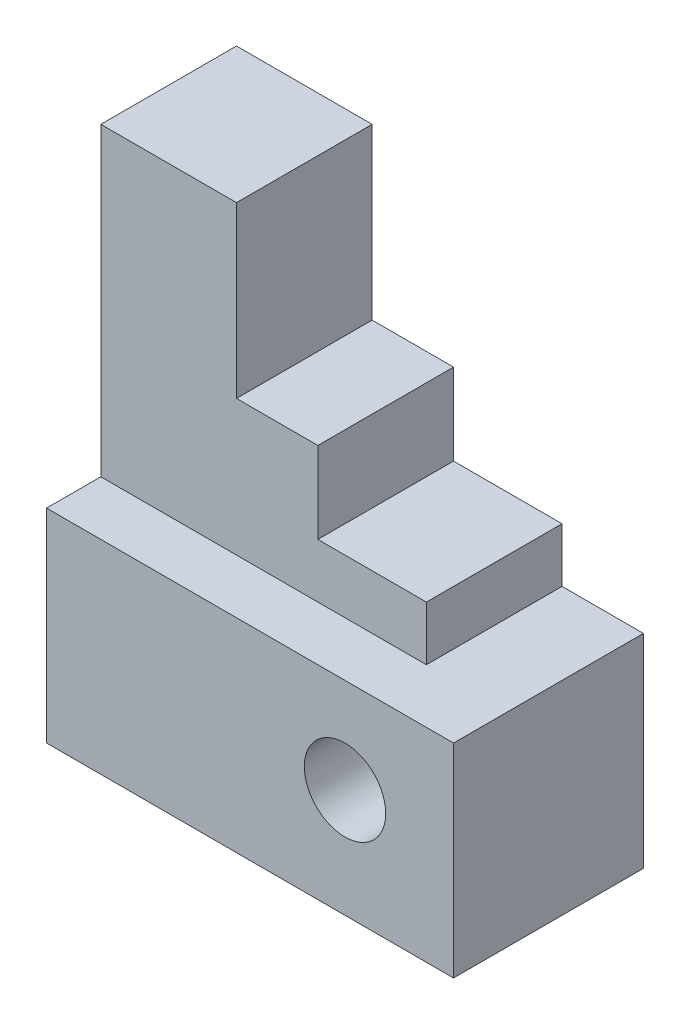
ISO-10303-21;
HEADER;
FILE_DESCRIPTION(('STEP AP214'),'2;1');
FILE_NAME('part.step','',(''),(''),'','','');
FILE_SCHEMA(('AUTOMOTIVE_DESIGN { 1 0 10303 214 1 1 1 1 }'));
ENDSEC;
DATA;
#1=APPLICATION_CONTEXT('core data for automotive mechanical design processes');
#2=APPLICATION_PROTOCOL_DEFINITION('international standard','automotive_design',2000,#1);
#3=PRODUCT_CONTEXT('',#1,'mechanical');
#4=PRODUCT('Part','Part','',(#3));
#5=PRODUCT_RELATED_PRODUCT_CATEGORY('part','',(#4));
#6=PRODUCT_DEFINITION_FORMATION('','',#4);
#7=PRODUCT_DEFINITION_CONTEXT('part definition',#1,'design');
#8=PRODUCT_DEFINITION('design','',#6,#7);
#9=PRODUCT_DEFINITION_SHAPE('','',#8);
#10=(LENGTH_UNIT() NAMED_UNIT(*) SI_UNIT(.MILLI.,.METRE.));
#11=(NAMED_UNIT(*) PLANE_ANGLE_UNIT() SI_UNIT($,.RADIAN.));
#12=(NAMED_UNIT(*) SI_UNIT($,.STERADIAN.) SOLID_ANGLE_UNIT());
#13=UNCERTAINTY_MEASURE_WITH_UNIT(LENGTH_MEASURE(1.E-05),#10,'distance_accuracy_value','');
#14=(GEOMETRIC_REPRESENTATION_CONTEXT(3) GLOBAL_UNCERTAINTY_ASSIGNED_CONTEXT((#13)) GLOBAL_UNIT_ASSIGNED_CONTEXT((#10,
#11,#12)) REPRESENTATION_CONTEXT('',''));
#15=CARTESIAN_POINT('',(0.,0.,0.));
#16=DIRECTION('',(0.,0.,1.));
#17=DIRECTION('',(1.,0.,0.));
#18=AXIS2_PLACEMENT_3D('',#15,#16,#17);
#19=CARTESIAN_POINT('',(0.,75.,-28.));
#20=DIRECTION('',(0.,0.,1.));
#21=DIRECTION('',(1.,0.,0.));
#22=AXIS2_PLACEMENT_3D('',#19,#20,#21);
#23=PLANE('',#22);
#24=CARTESIAN_POINT('',(44.,16.,-28.));
#25=DIRECTION('',(0.,0.,1.));
#26=DIRECTION('',(1.,0.,0.));
#27=AXIS2_PLACEMENT_3D('',#24,#25,#26);
#28=CIRCLE('',#27,6.);
#29=CARTESIAN_POINT('',(50.,16.,-28.));
#30=VERTEX_POINT('',#29);
#31=EDGE_CURVE('E176',#30,#30,#28,.T.);
#32=ORIENTED_EDGE('',*,*,#31,.T.);
#33=EDGE_LOOP('',(#32));
#34=FACE_BOUND('',#33,.T.);
#35=DIRECTION('',(0.,1.,0.));
#36=VECTOR('',#35,1.);
#37=CARTESIAN_POINT('',(20.,0.,-28.));
#38=LINE('',#37,#36);
#39=CARTESIAN_POINT('',(20.,50.,-28.));
#40=VERTEX_POINT('',#39);
#41=CARTESIAN_POINT('',(20.,75.,-28.));
#42=VERTEX_POINT('',#41);
#43=EDGE_CURVE('E224',#40,#42,#38,.T.);
#44=ORIENTED_EDGE('',*,*,#43,.F.);
#45=DIRECTION('',(-1.,0.,0.));
#46=VECTOR('',#45,1.);
#47=CARTESIAN_POINT('',(0.,50.,-28.));
#48=LINE('',#47,#46);
#49=CARTESIAN_POINT('',(32.,50.,-28.));
#50=VERTEX_POINT('',#49);
#51=EDGE_CURVE('E255',#50,#40,#48,.T.);
#52=ORIENTED_EDGE('',*,*,#51,.F.);
#53=DIRECTION('',(0.,1.,0.));
#54=VECTOR('',#53,1.);
#55=CARTESIAN_POINT('',(32.,0.,-28.));
#56=LINE('',#55,#54);
#57=CARTESIAN_POINT('',(32.,38.,-28.));
#58=VERTEX_POINT('',#57);
#59=EDGE_CURVE('E261',#58,#50,#56,.T.);
#60=ORIENTED_EDGE('',*,*,#59,.F.);
#61=DIRECTION('',(1.,0.,0.));
#62=VECTOR('',#61,1.);
#63=CARTESIAN_POINT('',(0.,38.,-28.));
#64=LINE('',#63,#62);
#65=CARTESIAN_POINT('',(48.,38.,-28.));
#66=VERTEX_POINT('',#65);
#67=EDGE_CURVE('E152',#58,#66,#64,.T.);
#68=ORIENTED_EDGE('',*,*,#67,.T.);
#69=DIRECTION('',(0.,1.,0.));
#70=VECTOR('',#69,1.);
#71=CARTESIAN_POINT('',(48.,30.,-28.));
#72=LINE('',#71,#70);
#73=CARTESIAN_POINT('',(48.,30.,-28.));
#74=VERTEX_POINT('',#73);
#75=EDGE_CURVE('E198',#74,#66,#72,.T.);
#76=ORIENTED_EDGE('',*,*,#75,.F.);
#77=DIRECTION('',(-1.,0.,0.));
#78=VECTOR('',#77,1.);
#79=CARTESIAN_POINT('',(60.,30.,-28.));
#80=LINE('',#79,#78);
#81=CARTESIAN_POINT('',(60.,30.,-28.));
#82=VERTEX_POINT('',#81);
#83=EDGE_CURVE('E92',#82,#74,#80,.T.);
#84=ORIENTED_EDGE('',*,*,#83,.F.);
#85=DIRECTION('',(0.,-1.,0.));
#86=VECTOR('',#85,1.);
#87=CARTESIAN_POINT('',(60.,75.,-28.));
#88=LINE('',#87,#86);
#89=CARTESIAN_POINT('',(60.,0.,-28.));
#90=VERTEX_POINT('',#89);
#91=EDGE_CURVE('E83',#82,#90,#88,.T.);
#92=ORIENTED_EDGE('',*,*,#91,.T.);
#93=DIRECTION('',(-1.,0.,0.));
#94=VECTOR('',#93,1.);
#95=CARTESIAN_POINT('',(0.,0.,-28.));
#96=LINE('',#95,#94);
#97=CARTESIAN_POINT('',(0.,0.,-28.));
#98=VERTEX_POINT('',#97);
#99=EDGE_CURVE('E87',#90,#98,#96,.T.);
#100=ORIENTED_EDGE('',*,*,#99,.T.);
#101=DIRECTION('',(0.,-1.,0.));
#102=VECTOR('',#101,1.);
#103=CARTESIAN_POINT('',(0.,75.,-28.));
#104=LINE('',#103,#102);
#105=CARTESIAN_POINT('',(0.,75.,-28.));
#106=VERTEX_POINT('',#105);
#107=EDGE_CURVE('E97',#106,#98,#104,.T.);
#108=ORIENTED_EDGE('',*,*,#107,.F.);
#109=DIRECTION('',(-1.,0.,0.));
#110=VECTOR('',#109,1.);
#111=CARTESIAN_POINT('',(0.,75.,-28.));
#112=LINE('',#111,#110);
#113=EDGE_CURVE('E64',#42,#106,#112,.T.);
#114=ORIENTED_EDGE('',*,*,#113,.F.);
#115=EDGE_LOOP('',(#44,#52,#60,#68,#76,#84,#92,#100,#108,#114));
#116=FACE_BOUND('',#115,.T.);
#117=ADVANCED_FACE('F39',(#34,#116),#23,.F.);
#118=CARTESIAN_POINT('',(0.,75.,0.));
#119=DIRECTION('',(0.,-1.,0.));
#120=DIRECTION('',(0.,0.,-1.));
#121=AXIS2_PLACEMENT_3D('',#118,#119,#120);
#122=PLANE('',#121);
#123=DIRECTION('',(0.,0.,1.));
#124=VECTOR('',#123,1.);
#125=CARTESIAN_POINT('',(20.,75.,-28.));
#126=LINE('',#125,#124);
#127=CARTESIAN_POINT('',(20.,75.,-8.));
#128=VERTEX_POINT('',#127);
#129=EDGE_CURVE('E165',#42,#128,#126,.T.);
#130=ORIENTED_EDGE('',*,*,#129,.F.);
#131=ORIENTED_EDGE('',*,*,#113,.T.);
#132=DIRECTION('',(0.,0.,1.));
#133=VECTOR('',#132,1.);
#134=CARTESIAN_POINT('',(0.,75.,0.));
#135=LINE('',#134,#133);
#136=CARTESIAN_POINT('',(0.,75.,-8.));
#137=VERTEX_POINT('',#136);
#138=EDGE_CURVE('E114',#106,#137,#135,.T.);
#139=ORIENTED_EDGE('',*,*,#138,.T.);
#140=DIRECTION('',(-1.,0.,0.));
#141=VECTOR('',#140,1.);
#142=CARTESIAN_POINT('',(0.,75.,-8.));
#143=LINE('',#142,#141);
#144=EDGE_CURVE('E164',#128,#137,#143,.T.);
#145=ORIENTED_EDGE('',*,*,#144,.F.);
#146=EDGE_LOOP('',(#130,#131,#139,#145));
#147=FACE_BOUND('',#146,.T.);
#148=ADVANCED_FACE('F248',(#147),#122,.F.);
#149=CARTESIAN_POINT('',(0.,30.,-8.));
#150=DIRECTION('',(0.,0.,-1.));
#151=DIRECTION('',(-1.,0.,0.));
#152=AXIS2_PLACEMENT_3D('',#149,#150,#151);
#153=PLANE('',#152);
#154=DIRECTION('',(0.,-1.,0.));
#155=VECTOR('',#154,1.);
#156=CARTESIAN_POINT('',(20.,30.,-8.));
#157=LINE('',#156,#155);
#158=CARTESIAN_POINT('',(20.,50.,-8.));
#159=VERTEX_POINT('',#158);
#160=EDGE_CURVE('E11',#128,#159,#157,.T.);
#161=ORIENTED_EDGE('',*,*,#160,.F.);
#162=ORIENTED_EDGE('',*,*,#144,.T.);
#163=DIRECTION('',(0.,1.,0.));
#164=VECTOR('',#163,1.);
#165=CARTESIAN_POINT('',(0.,30.,-8.));
#166=LINE('',#165,#164);
#167=CARTESIAN_POINT('',(0.,30.,-8.));
#168=VERTEX_POINT('',#167);
#169=EDGE_CURVE('E200',#168,#137,#166,.T.);
#170=ORIENTED_EDGE('',*,*,#169,.F.);
#171=DIRECTION('',(-1.,0.,0.));
#172=VECTOR('',#171,1.);
#173=CARTESIAN_POINT('',(0.,30.,-8.));
#174=LINE('',#173,#172);
#175=CARTESIAN_POINT('',(48.,30.,-8.));
#176=VERTEX_POINT('',#175);
#177=EDGE_CURVE('E187',#176,#168,#174,.T.);
#178=ORIENTED_EDGE('',*,*,#177,.F.);
#179=DIRECTION('',(0.,1.,0.));
#180=VECTOR('',#179,1.);
#181=CARTESIAN_POINT('',(48.,30.,-8.));
#182=LINE('',#181,#180);
#183=CARTESIAN_POINT('',(48.,38.,-8.));
#184=VERTEX_POINT('',#183);
#185=EDGE_CURVE('E162',#176,#184,#182,.T.);
#186=ORIENTED_EDGE('',*,*,#185,.T.);
#187=DIRECTION('',(-1.,0.,0.));
#188=VECTOR('',#187,1.);
#189=CARTESIAN_POINT('',(0.,38.,-8.));
#190=LINE('',#189,#188);
#191=CARTESIAN_POINT('',(32.,38.,-8.));
#192=VERTEX_POINT('',#191);
#193=EDGE_CURVE('E55',#184,#192,#190,.T.);
#194=ORIENTED_EDGE('',*,*,#193,.T.);
#195=DIRECTION('',(0.,-1.,0.));
#196=VECTOR('',#195,1.);
#197=CARTESIAN_POINT('',(32.,30.,-8.));
#198=LINE('',#197,#196);
#199=CARTESIAN_POINT('',(32.,50.,-8.));
#200=VERTEX_POINT('',#199);
#201=EDGE_CURVE('E48',#200,#192,#198,.T.);
#202=ORIENTED_EDGE('',*,*,#201,.F.);
#203=DIRECTION('',(1.,0.,0.));
#204=VECTOR('',#203,1.);
#205=CARTESIAN_POINT('',(0.,50.,-8.));
#206=LINE('',#205,#204);
#207=EDGE_CURVE('E127',#159,#200,#206,.T.);
#208=ORIENTED_EDGE('',*,*,#207,.F.);
#209=EDGE_LOOP('',(#161,#162,#170,#178,#186,#194,#202,#208));
#210=FACE_BOUND('',#209,.T.);
#211=ADVANCED_FACE('F159',(#210),#153,.F.);
#212=CARTESIAN_POINT('',(0.,75.,0.));
#213=DIRECTION('',(1.,0.,0.));
#214=DIRECTION('',(0.,0.,-1.));
#215=AXIS2_PLACEMENT_3D('',#212,#213,#214);
#216=PLANE('',#215);
#217=DIRECTION('',(0.,0.,1.));
#218=VECTOR('',#217,1.);
#219=CARTESIAN_POINT('',(0.,30.,0.));
#220=LINE('',#219,#218);
#221=CARTESIAN_POINT('',(0.,30.,0.));
#222=VERTEX_POINT('',#221);
#223=EDGE_CURVE('E191',#168,#222,#220,.T.);
#224=ORIENTED_EDGE('',*,*,#223,.F.);
#225=ORIENTED_EDGE('',*,*,#169,.T.);
#226=ORIENTED_EDGE('',*,*,#138,.F.);
#227=ORIENTED_EDGE('',*,*,#107,.T.);
#228=DIRECTION('',(0.,0.,1.));
#229=VECTOR('',#228,1.);
#230=CARTESIAN_POINT('',(0.,0.,0.));
#231=LINE('',#230,#229);
#232=CARTESIAN_POINT('',(0.,0.,0.));
#233=VERTEX_POINT('',#232);
#234=EDGE_CURVE('E112',#98,#233,#231,.T.);
#235=ORIENTED_EDGE('',*,*,#234,.T.);
#236=DIRECTION('',(0.,-1.,0.));
#237=VECTOR('',#236,1.);
#238=CARTESIAN_POINT('',(0.,75.,0.));
#239=LINE('',#238,#237);
#240=EDGE_CURVE('E124',#222,#233,#239,.T.);
#241=ORIENTED_EDGE('',*,*,#240,.F.);
#242=EDGE_LOOP('',(#224,#225,#226,#227,#235,#241));
#243=FACE_BOUND('',#242,.T.);
#244=ADVANCED_FACE('F41',(#243),#216,.F.);
#245=CARTESIAN_POINT('',(0.,75.,0.));
#246=DIRECTION('',(0.,0.,-1.));
#247=DIRECTION('',(-1.,0.,0.));
#248=AXIS2_PLACEMENT_3D('',#245,#246,#247);
#249=PLANE('',#248);
#250=CARTESIAN_POINT('',(44.,16.,0.));
#251=DIRECTION('',(0.,0.,1.));
#252=DIRECTION('',(1.,0.,0.));
#253=AXIS2_PLACEMENT_3D('',#250,#251,#252);
#254=CIRCLE('',#253,6.);
#255=CARTESIAN_POINT('',(50.,16.,0.));
#256=VERTEX_POINT('',#255);
#257=EDGE_CURVE('E263',#256,#256,#254,.T.);
#258=ORIENTED_EDGE('',*,*,#257,.F.);
#259=EDGE_LOOP('',(#258));
#260=FACE_BOUND('',#259,.T.);
#261=DIRECTION('',(0.,-1.,0.));
#262=VECTOR('',#261,1.);
#263=CARTESIAN_POINT('',(60.,75.,0.));
#264=LINE('',#263,#262);
#265=CARTESIAN_POINT('',(60.,30.,0.));
#266=VERTEX_POINT('',#265);
#267=CARTESIAN_POINT('',(60.,0.,0.));
#268=VERTEX_POINT('',#267);
#269=EDGE_CURVE('E96',#266,#268,#264,.T.);
#270=ORIENTED_EDGE('',*,*,#269,.F.);
#271=DIRECTION('',(1.,0.,0.));
#272=VECTOR('',#271,1.);
#273=CARTESIAN_POINT('',(0.,30.,0.));
#274=LINE('',#273,#272);
#275=EDGE_CURVE('E195',#222,#266,#274,.T.);
#276=ORIENTED_EDGE('',*,*,#275,.F.);
#277=ORIENTED_EDGE('',*,*,#240,.T.);
#278=DIRECTION('',(1.,0.,0.));
#279=VECTOR('',#278,1.);
#280=CARTESIAN_POINT('',(0.,0.,0.));
#281=LINE('',#280,#279);
#282=EDGE_CURVE('E107',#233,#268,#281,.T.);
#283=ORIENTED_EDGE('',*,*,#282,.T.);
#284=EDGE_LOOP('',(#270,#276,#277,#283));
#285=FACE_BOUND('',#284,.T.);
#286=ADVANCED_FACE('F214',(#260,#285),#249,.F.);
#287=CARTESIAN_POINT('',(60.,75.,0.));
#288=DIRECTION('',(-1.,0.,0.));
#289=DIRECTION('',(0.,0.,1.));
#290=AXIS2_PLACEMENT_3D('',#287,#288,#289);
#291=PLANE('',#290);
#292=ORIENTED_EDGE('',*,*,#91,.F.);
#293=DIRECTION('',(0.,0.,-1.));
#294=VECTOR('',#293,1.);
#295=CARTESIAN_POINT('',(60.,30.,-28.));
#296=LINE('',#295,#294);
#297=EDGE_CURVE('E170',#266,#82,#296,.T.);
#298=ORIENTED_EDGE('',*,*,#297,.F.);
#299=ORIENTED_EDGE('',*,*,#269,.T.);
#300=DIRECTION('',(0.,0.,-1.));
#301=VECTOR('',#300,1.);
#302=CARTESIAN_POINT('',(60.,0.,0.));
#303=LINE('',#302,#301);
#304=EDGE_CURVE('E100',#268,#90,#303,.T.);
#305=ORIENTED_EDGE('',*,*,#304,.T.);
#306=EDGE_LOOP('',(#292,#298,#299,#305));
#307=FACE_BOUND('',#306,.T.);
#308=ADVANCED_FACE('F101',(#307),#291,.F.);
#309=CARTESIAN_POINT('',(0.,0.,0.));
#310=DIRECTION('',(0.,-1.,0.));
#311=DIRECTION('',(0.,0.,-1.));
#312=AXIS2_PLACEMENT_3D('',#309,#310,#311);
#313=PLANE('',#312);
#314=ORIENTED_EDGE('',*,*,#234,.F.);
#315=ORIENTED_EDGE('',*,*,#99,.F.);
#316=ORIENTED_EDGE('',*,*,#304,.F.);
#317=ORIENTED_EDGE('',*,*,#282,.F.);
#318=EDGE_LOOP('',(#314,#315,#316,#317));
#319=FACE_BOUND('',#318,.T.);
#320=ADVANCED_FACE('F110',(#319),#313,.T.);
#321=CARTESIAN_POINT('',(48.,30.,-28.));
#322=DIRECTION('',(-1.,0.,0.));
#323=DIRECTION('',(0.,0.,1.));
#324=AXIS2_PLACEMENT_3D('',#321,#322,#323);
#325=PLANE('',#324);
#326=ORIENTED_EDGE('',*,*,#75,.T.);
#327=DIRECTION('',(0.,0.,1.));
#328=VECTOR('',#327,1.);
#329=CARTESIAN_POINT('',(48.,38.,-28.));
#330=LINE('',#329,#328);
#331=EDGE_CURVE('E155',#66,#184,#330,.T.);
#332=ORIENTED_EDGE('',*,*,#331,.T.);
#333=ORIENTED_EDGE('',*,*,#185,.F.);
#334=DIRECTION('',(0.,0.,1.));
#335=VECTOR('',#334,1.);
#336=CARTESIAN_POINT('',(48.,30.,-28.));
#337=LINE('',#336,#335);
#338=EDGE_CURVE('E183',#74,#176,#337,.T.);
#339=ORIENTED_EDGE('',*,*,#338,.F.);
#340=EDGE_LOOP('',(#326,#332,#333,#339));
#341=FACE_BOUND('',#340,.T.);
#342=ADVANCED_FACE('F281',(#341),#325,.F.);
#343=CARTESIAN_POINT('',(0.,30.,0.));
#344=DIRECTION('',(0.,-1.,0.));
#345=DIRECTION('',(0.,0.,-1.));
#346=AXIS2_PLACEMENT_3D('',#343,#344,#345);
#347=PLANE('',#346);
#348=ORIENTED_EDGE('',*,*,#297,.T.);
#349=ORIENTED_EDGE('',*,*,#83,.T.);
#350=ORIENTED_EDGE('',*,*,#338,.T.);
#351=ORIENTED_EDGE('',*,*,#177,.T.);
#352=ORIENTED_EDGE('',*,*,#223,.T.);
#353=ORIENTED_EDGE('',*,*,#275,.T.);
#354=EDGE_LOOP('',(#348,#349,#350,#351,#352,#353));
#355=FACE_BOUND('',#354,.T.);
#356=ADVANCED_FACE('F246',(#355),#347,.F.);
#357=CARTESIAN_POINT('',(20.,0.,-28.));
#358=DIRECTION('',(1.,0.,0.));
#359=DIRECTION('',(0.,0.,-1.));
#360=AXIS2_PLACEMENT_3D('',#357,#358,#359);
#361=PLANE('',#360);
#362=ORIENTED_EDGE('',*,*,#160,.T.);
#363=DIRECTION('',(0.,0.,1.));
#364=VECTOR('',#363,1.);
#365=CARTESIAN_POINT('',(20.,50.,-28.));
#366=LINE('',#365,#364);
#367=EDGE_CURVE('E251',#40,#159,#366,.T.);
#368=ORIENTED_EDGE('',*,*,#367,.F.);
#369=ORIENTED_EDGE('',*,*,#43,.T.);
#370=ORIENTED_EDGE('',*,*,#129,.T.);
#371=EDGE_LOOP('',(#362,#368,#369,#370));
#372=FACE_BOUND('',#371,.T.);
#373=ADVANCED_FACE('F250',(#372),#361,.T.);
#374=CARTESIAN_POINT('',(32.,0.,-28.));
#375=DIRECTION('',(1.,0.,0.));
#376=DIRECTION('',(0.,0.,-1.));
#377=AXIS2_PLACEMENT_3D('',#374,#375,#376);
#378=PLANE('',#377);
#379=ORIENTED_EDGE('',*,*,#201,.T.);
#380=DIRECTION('',(0.,0.,1.));
#381=VECTOR('',#380,1.);
#382=CARTESIAN_POINT('',(32.,38.,-28.));
#383=LINE('',#382,#381);
#384=EDGE_CURVE('E140',#58,#192,#383,.T.);
#385=ORIENTED_EDGE('',*,*,#384,.F.);
#386=ORIENTED_EDGE('',*,*,#59,.T.);
#387=DIRECTION('',(0.,0.,1.));
#388=VECTOR('',#387,1.);
#389=CARTESIAN_POINT('',(32.,50.,-28.));
#390=LINE('',#389,#388);
#391=EDGE_CURVE('E144',#50,#200,#390,.T.);
#392=ORIENTED_EDGE('',*,*,#391,.T.);
#393=EDGE_LOOP('',(#379,#385,#386,#392));
#394=FACE_BOUND('',#393,.T.);
#395=ADVANCED_FACE('F137',(#394),#378,.T.);
#396=CARTESIAN_POINT('',(0.,50.,-28.));
#397=DIRECTION('',(0.,1.,0.));
#398=DIRECTION('',(0.,0.,1.));
#399=AXIS2_PLACEMENT_3D('',#396,#397,#398);
#400=PLANE('',#399);
#401=ORIENTED_EDGE('',*,*,#207,.T.);
#402=ORIENTED_EDGE('',*,*,#391,.F.);
#403=ORIENTED_EDGE('',*,*,#51,.T.);
#404=ORIENTED_EDGE('',*,*,#367,.T.);
#405=EDGE_LOOP('',(#401,#402,#403,#404));
#406=FACE_BOUND('',#405,.T.);
#407=ADVANCED_FACE('F254',(#406),#400,.T.);
#408=CARTESIAN_POINT('',(0.,38.,-28.));
#409=DIRECTION('',(0.,-1.,0.));
#410=DIRECTION('',(0.,0.,-1.));
#411=AXIS2_PLACEMENT_3D('',#408,#409,#410);
#412=PLANE('',#411);
#413=ORIENTED_EDGE('',*,*,#331,.F.);
#414=ORIENTED_EDGE('',*,*,#67,.F.);
#415=ORIENTED_EDGE('',*,*,#384,.T.);
#416=ORIENTED_EDGE('',*,*,#193,.F.);
#417=EDGE_LOOP('',(#413,#414,#415,#416));
#418=FACE_BOUND('',#417,.T.);
#419=ADVANCED_FACE('F150',(#418),#412,.F.);
#420=CARTESIAN_POINT('',(44.,16.,-28.));
#421=DIRECTION('',(0.,0.,1.));
#422=DIRECTION('',(1.,0.,0.));
#423=AXIS2_PLACEMENT_3D('',#420,#421,#422);
#424=CYLINDRICAL_SURFACE('',#423,6.);
#425=ORIENTED_EDGE('',*,*,#31,.F.);
#426=EDGE_LOOP('',(#425));
#427=FACE_BOUND('',#426,.T.);
#428=ORIENTED_EDGE('',*,*,#257,.T.);
#429=EDGE_LOOP('',(#428));
#430=FACE_BOUND('',#429,.T.);
#431=ADVANCED_FACE('F313',(#427,#430),#424,.F.);
#432=CLOSED_SHELL('',(#117,#148,#211,#244,#286,#308,#320,#342,#356,#373,#395,#407,#419,#431));
#433=MANIFOLD_SOLID_BREP('B2',#432);
#434=ADVANCED_BREP_SHAPE_REPRESENTATION('',(#18,#433),#14);
#435=SHAPE_DEFINITION_REPRESENTATION(#9,#434);
ENDSEC;
END-ISO-10303-21;
